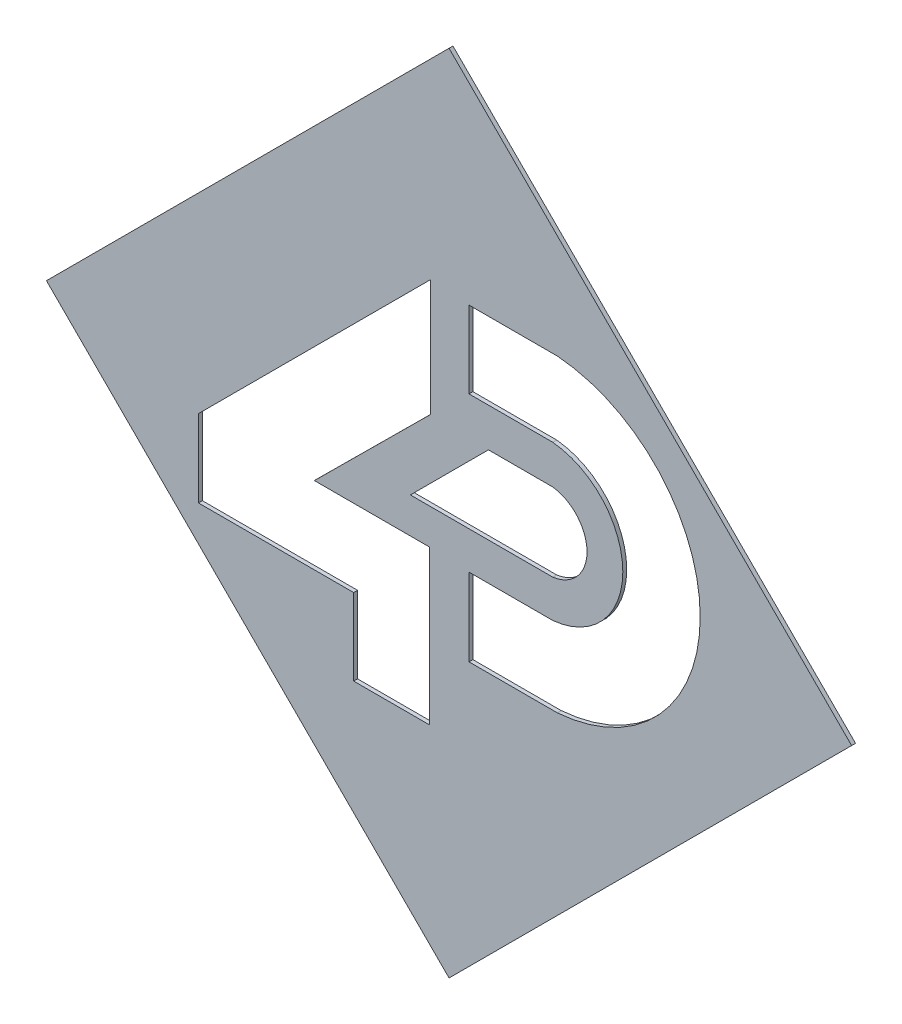
ISO-10303-21;
HEADER;
FILE_DESCRIPTION(('STEP AP214'),'2;1');
FILE_NAME('part.step','',(''),(''),'','','');
FILE_SCHEMA(('AUTOMOTIVE_DESIGN { 1 0 10303 214 1 1 1 1 }'));
ENDSEC;
DATA;
#1=APPLICATION_CONTEXT('core data for automotive mechanical design processes');
#2=APPLICATION_PROTOCOL_DEFINITION('international standard','automotive_design',2000,#1);
#3=PRODUCT_CONTEXT('',#1,'mechanical');
#4=PRODUCT('Part','Part','',(#3));
#5=PRODUCT_RELATED_PRODUCT_CATEGORY('part','',(#4));
#6=PRODUCT_DEFINITION_FORMATION('','',#4);
#7=PRODUCT_DEFINITION_CONTEXT('part definition',#1,'design');
#8=PRODUCT_DEFINITION('design','',#6,#7);
#9=PRODUCT_DEFINITION_SHAPE('','',#8);
#10=(LENGTH_UNIT() NAMED_UNIT(*) SI_UNIT(.MILLI.,.METRE.));
#11=(NAMED_UNIT(*) PLANE_ANGLE_UNIT() SI_UNIT($,.RADIAN.));
#12=(NAMED_UNIT(*) SI_UNIT($,.STERADIAN.) SOLID_ANGLE_UNIT());
#13=UNCERTAINTY_MEASURE_WITH_UNIT(LENGTH_MEASURE(1.E-05),#10,'distance_accuracy_value','');
#14=(GEOMETRIC_REPRESENTATION_CONTEXT(3) GLOBAL_UNCERTAINTY_ASSIGNED_CONTEXT((#13)) GLOBAL_UNIT_ASSIGNED_CONTEXT((#10,
#11,#12)) REPRESENTATION_CONTEXT('',''));
#15=CARTESIAN_POINT('',(0.,0.,0.));
#16=DIRECTION('',(0.,0.,1.));
#17=DIRECTION('',(1.,0.,0.));
#18=AXIS2_PLACEMENT_3D('',#15,#16,#17);
#19=CARTESIAN_POINT('',(5.70723061699978,-5.74708109341422,0.));
#20=DIRECTION('',(0.,0.,1.));
#21=DIRECTION('',(1.,0.,0.));
#22=AXIS2_PLACEMENT_3D('',#19,#20,#21);
#23=PLANE('',#22);
#24=DIRECTION('',(0.,1.,0.));
#25=VECTOR('',#24,1.);
#26=CARTESIAN_POINT('',(5.96345196568636,-5.74708109341422,0.));
#27=LINE('',#26,#25);
#28=CARTESIAN_POINT('',(5.96345196568636,7.21563884518157,0.));
#29=VERTEX_POINT('',#28);
#30=CARTESIAN_POINT('',(5.96345196568636,8.20293418286308,0.));
#31=VERTEX_POINT('',#30);
#32=EDGE_CURVE('E121',#29,#31,#27,.T.);
#33=ORIENTED_EDGE('',*,*,#32,.F.);
#34=DIRECTION('',(1.,0.,0.));
#35=VECTOR('',#34,1.);
#36=CARTESIAN_POINT('',(5.70723061699978,7.21563884518157,0.));
#37=LINE('',#36,#35);
#38=CARTESIAN_POINT('',(7.03943189194238,7.21563884518157,0.));
#39=VERTEX_POINT('',#38);
#40=EDGE_CURVE('E152',#39,#29,#37,.F.);
#41=ORIENTED_EDGE('',*,*,#40,.F.);
#42=CARTESIAN_POINT('',(6.94219559330286,6.22518063234392,0.));
#43=DIRECTION('',(0.,0.,-1.));
#44=DIRECTION('',(-1.,0.,0.));
#45=AXIS2_PLACEMENT_3D('',#42,#43,#44);
#46=CIRCLE('',#45,0.995219759224392);
#47=CARTESIAN_POINT('',(7.03943189194239,5.23472241950628,0.));
#48=VERTEX_POINT('',#47);
#49=EDGE_CURVE('E193',#48,#39,#46,.F.);
#50=ORIENTED_EDGE('',*,*,#49,.F.);
#51=DIRECTION('',(1.,0.,0.));
#52=VECTOR('',#51,1.);
#53=CARTESIAN_POINT('',(5.70723061699978,5.23472241950628,0.));
#54=LINE('',#53,#52);
#55=CARTESIAN_POINT('',(5.96345196568636,5.23472241950628,0.));
#56=VERTEX_POINT('',#55);
#57=EDGE_CURVE('E145',#56,#48,#54,.T.);
#58=ORIENTED_EDGE('',*,*,#57,.F.);
#59=DIRECTION('',(0.,1.,0.));
#60=VECTOR('',#59,1.);
#61=CARTESIAN_POINT('',(5.96345196568636,-5.74708109341422,0.));
#62=LINE('',#61,#60);
#63=CARTESIAN_POINT('',(5.96345196568636,4.23736010570448,0.));
#64=VERTEX_POINT('',#63);
#65=EDGE_CURVE('E156',#64,#56,#62,.T.);
#66=ORIENTED_EDGE('',*,*,#65,.F.);
#67=DIRECTION('',(1.,0.,0.));
#68=VECTOR('',#67,1.);
#69=CARTESIAN_POINT('',(5.70723061699978,4.23736010570448,0.));
#70=LINE('',#69,#68);
#71=CARTESIAN_POINT('',(7.09791288915832,4.23736010570448,0.));
#72=VERTEX_POINT('',#71);
#73=EDGE_CURVE('E162',#72,#64,#70,.F.);
#74=ORIENTED_EDGE('',*,*,#73,.F.);
#75=CARTESIAN_POINT('',(6.94208071668398,6.22014714428378,0.));
#76=DIRECTION('',(0.,0.,-1.));
#77=DIRECTION('',(-1.,0.,0.));
#78=AXIS2_PLACEMENT_3D('',#75,#76,#77);
#79=CIRCLE('',#78,1.98890123091524);
#80=CARTESIAN_POINT('',(7.09791288915832,8.20293418286308,0.));
#81=VERTEX_POINT('',#80);
#82=EDGE_CURVE('E165',#72,#81,#79,.F.);
#83=ORIENTED_EDGE('',*,*,#82,.T.);
#84=DIRECTION('',(1.,0.,0.));
#85=VECTOR('',#84,1.);
#86=CARTESIAN_POINT('',(5.70723061699978,8.20293418286308,0.));
#87=LINE('',#86,#85);
#88=EDGE_CURVE('E139',#31,#81,#87,.T.);
#89=ORIENTED_EDGE('',*,*,#88,.F.);
#90=EDGE_LOOP('',(#33,#41,#50,#58,#66,#74,#83,#89));
#91=FACE_BOUND('',#90,.T.);
#92=DIRECTION('',(-0.707106781186548,-0.707106781186547,0.));
#93=VECTOR('',#92,1.);
#94=CARTESIAN_POINT('',(-1.40455660225023,1.3647061258358,0.));
#95=LINE('',#94,#93);
#96=CARTESIAN_POINT('',(5.46891482688808,8.23817755497411,0.));
#97=VERTEX_POINT('',#96);
#98=CARTESIAN_POINT('',(2.49050407814656,5.25976680623259,0.));
#99=VERTEX_POINT('',#98);
#100=EDGE_CURVE('E142',#97,#99,#95,.T.);
#101=ORIENTED_EDGE('',*,*,#100,.T.);
#102=DIRECTION('',(0.,1.,0.));
#103=VECTOR('',#102,1.);
#104=CARTESIAN_POINT('',(2.49050407814656,-5.74708109341422,0.));
#105=LINE('',#104,#103);
#106=CARTESIAN_POINT('',(2.49050407814656,4.26743866233876,0.));
#107=VERTEX_POINT('',#106);
#108=EDGE_CURVE('E221',#99,#107,#105,.F.);
#109=ORIENTED_EDGE('',*,*,#108,.T.);
#110=DIRECTION('',(1.,0.,0.));
#111=VECTOR('',#110,1.);
#112=CARTESIAN_POINT('',(5.70723061699978,4.26743866233876,0.));
#113=LINE('',#112,#111);
#114=CARTESIAN_POINT('',(4.48311490015382,4.26743866233876,0.));
#115=VERTEX_POINT('',#114);
#116=EDGE_CURVE('E227',#107,#115,#113,.T.);
#117=ORIENTED_EDGE('',*,*,#116,.T.);
#118=DIRECTION('',(0.,1.,0.));
#119=VECTOR('',#118,1.);
#120=CARTESIAN_POINT('',(4.48311490015382,-5.74708109341422,0.));
#121=LINE('',#120,#119);
#122=CARTESIAN_POINT('',(4.48311490015382,3.28306505266452,0.));
#123=VERTEX_POINT('',#122);
#124=EDGE_CURVE('E236',#123,#115,#121,.T.);
#125=ORIENTED_EDGE('',*,*,#124,.F.);
#126=DIRECTION('',(1.,0.,0.));
#127=VECTOR('',#126,1.);
#128=CARTESIAN_POINT('',(5.70723061699978,3.28306505266452,0.));
#129=LINE('',#128,#127);
#130=CARTESIAN_POINT('',(5.45754534205358,3.28306505266452,0.));
#131=VERTEX_POINT('',#130);
#132=EDGE_CURVE('E242',#131,#123,#129,.F.);
#133=ORIENTED_EDGE('',*,*,#132,.F.);
#134=DIRECTION('',(0.,1.,0.));
#135=VECTOR('',#134,1.);
#136=CARTESIAN_POINT('',(5.45754534205358,-5.74708109341422,0.));
#137=LINE('',#136,#135);
#138=CARTESIAN_POINT('',(5.45754534205358,5.2597668062326,0.));
#139=VERTEX_POINT('',#138);
#140=EDGE_CURVE('E248',#139,#131,#137,.F.);
#141=ORIENTED_EDGE('',*,*,#140,.F.);
#142=DIRECTION('',(1.,0.,0.));
#143=VECTOR('',#142,1.);
#144=CARTESIAN_POINT('',(5.70723061699978,5.2597668062326,0.));
#145=LINE('',#144,#143);
#146=CARTESIAN_POINT('',(3.97800197720987,5.2597668062326,0.));
#147=VERTEX_POINT('',#146);
#148=EDGE_CURVE('E254',#147,#139,#145,.T.);
#149=ORIENTED_EDGE('',*,*,#148,.F.);
#150=DIRECTION('',(0.709780855705061,0.704422555625948,0.));
#151=VECTOR('',#150,1.);
#152=CARTESIAN_POINT('',(-0.654097831195002,0.662635792168032,0.));
#153=LINE('',#152,#151);
#154=CARTESIAN_POINT('',(5.46891482688808,6.73942440948345,0.));
#155=VERTEX_POINT('',#154);
#156=EDGE_CURVE('E257',#147,#155,#153,.T.);
#157=ORIENTED_EDGE('',*,*,#156,.T.);
#158=DIRECTION('',(0.,1.,0.));
#159=VECTOR('',#158,1.);
#160=CARTESIAN_POINT('',(5.46891482688808,-5.74708109341422,0.));
#161=LINE('',#160,#159);
#162=EDGE_CURVE('E263',#155,#97,#161,.T.);
#163=ORIENTED_EDGE('',*,*,#162,.T.);
#164=EDGE_LOOP('',(#101,#109,#117,#125,#133,#141,#149,#157,#163));
#165=FACE_BOUND('',#164,.T.);
#166=DIRECTION('',(0.707106781186547,0.707106781186548,0.));
#167=VECTOR('',#166,1.);
#168=CARTESIAN_POINT('',(-2.63109995533968,2.59124947892523,0.));
#169=LINE('',#168,#167);
#170=CARTESIAN_POINT('',(0.539968183111775,5.76231761737669,0.));
#171=VERTEX_POINT('',#170);
#172=CARTESIAN_POINT('',(5.70723061699977,10.9295800512647,0.));
#173=VERTEX_POINT('',#172);
#174=EDGE_CURVE('E266',#171,#173,#169,.T.);
#175=ORIENTED_EDGE('',*,*,#174,.T.);
#176=DIRECTION('',(0.707106781186548,-0.707106781186547,0.));
#177=VECTOR('',#176,1.);
#178=CARTESIAN_POINT('',(14.0455611893392,2.59124947892525,0.));
#179=LINE('',#178,#177);
#180=CARTESIAN_POINT('',(10.8744930508878,5.7623176173767,0.));
#181=VERTEX_POINT('',#180);
#182=EDGE_CURVE('E275',#173,#181,#179,.T.);
#183=ORIENTED_EDGE('',*,*,#182,.T.);
#184=DIRECTION('',(-0.707106781186547,-0.707106781186548,0.));
#185=VECTOR('',#184,1.);
#186=CARTESIAN_POINT('',(2.53616247854832,-2.57601295496276,0.));
#187=LINE('',#186,#185);
#188=CARTESIAN_POINT('',(5.70723061700028,0.595055183489199,0.));
#189=VERTEX_POINT('',#188);
#190=EDGE_CURVE('E281',#181,#189,#187,.T.);
#191=ORIENTED_EDGE('',*,*,#190,.T.);
#192=DIRECTION('',(0.707106781186686,-0.707106781186409,0.));
#193=VECTOR('',#192,1.);
#194=CARTESIAN_POINT('',(8.87829875545224,-2.57601295496051,0.));
#195=LINE('',#194,#193);
#196=EDGE_CURVE('E174',#171,#189,#195,.T.);
#197=ORIENTED_EDGE('',*,*,#196,.F.);
#198=EDGE_LOOP('',(#175,#183,#191,#197));
#199=FACE_BOUND('',#198,.T.);
#200=DIRECTION('',(-0.707106781186546,-0.707106781186549,0.));
#201=VECTOR('',#200,1.);
#202=CARTESIAN_POINT('',(-0.272743000415149,0.23289252400069,0.));
#203=LINE('',#202,#201);
#204=CARTESIAN_POINT('',(6.21265730286866,6.71829282728453,0.));
#205=VERTEX_POINT('',#204);
#206=CARTESIAN_POINT('',(5.21083901499033,5.71647453940619,0.));
#207=VERTEX_POINT('',#206);
#208=EDGE_CURVE('E135',#205,#207,#203,.T.);
#209=ORIENTED_EDGE('',*,*,#208,.T.);
#210=DIRECTION('',(1.,0.,0.));
#211=VECTOR('',#210,1.);
#212=CARTESIAN_POINT('',(5.70723061699978,5.71647453940619,0.));
#213=LINE('',#212,#211);
#214=CARTESIAN_POINT('',(7.03943189194239,5.71647453940619,0.));
#215=VERTEX_POINT('',#214);
#216=EDGE_CURVE('E108',#215,#207,#213,.F.);
#217=ORIENTED_EDGE('',*,*,#216,.F.);
#218=CARTESIAN_POINT('',(6.97275420186405,6.21738368334536,0.));
#219=DIRECTION('',(0.,0.,-1.));
#220=DIRECTION('',(-1.,0.,0.));
#221=AXIS2_PLACEMENT_3D('',#218,#219,#220);
#222=CIRCLE('',#221,0.505327502552606);
#223=CARTESIAN_POINT('',(7.0394318919424,6.71829282728453,0.));
#224=VERTEX_POINT('',#223);
#225=EDGE_CURVE('E19',#215,#224,#222,.F.);
#226=ORIENTED_EDGE('',*,*,#225,.T.);
#227=DIRECTION('',(1.,0.,0.));
#228=VECTOR('',#227,1.);
#229=CARTESIAN_POINT('',(5.70723061699978,6.71829282728452,0.));
#230=LINE('',#229,#228);
#231=EDGE_CURVE('E113',#224,#205,#230,.F.);
#232=ORIENTED_EDGE('',*,*,#231,.T.);
#233=EDGE_LOOP('',(#209,#217,#226,#232));
#234=FACE_BOUND('',#233,.T.);
#235=ADVANCED_FACE('F16',(#91,#165,#199,#234),#23,.F.);
#236=CARTESIAN_POINT('',(5.70723061699978,6.71829282728452,0.05));
#237=DIRECTION('',(0.,1.,0.));
#238=DIRECTION('',(0.,0.,1.));
#239=AXIS2_PLACEMENT_3D('',#236,#237,#238);
#240=PLANE('',#239);
#241=DIRECTION('',(0.,0.,-1.));
#242=VECTOR('',#241,1.);
#243=CARTESIAN_POINT('',(7.03943189194239,6.71829282728453,0.05));
#244=LINE('',#243,#242);
#245=CARTESIAN_POINT('',(7.03943189194239,6.71829282728453,0.05));
#246=VERTEX_POINT('',#245);
#247=EDGE_CURVE('E116',#224,#246,#244,.F.);
#248=ORIENTED_EDGE('',*,*,#247,.T.);
#249=DIRECTION('',(1.,0.,0.));
#250=VECTOR('',#249,1.);
#251=CARTESIAN_POINT('',(5.70723061699978,6.71829282728453,0.05));
#252=LINE('',#251,#250);
#253=CARTESIAN_POINT('',(6.21265730286866,6.71829282728453,0.05));
#254=VERTEX_POINT('',#253);
#255=EDGE_CURVE('E192',#254,#246,#252,.T.);
#256=ORIENTED_EDGE('',*,*,#255,.F.);
#257=DIRECTION('',(0.,0.,1.));
#258=VECTOR('',#257,1.);
#259=CARTESIAN_POINT('',(6.21265730286866,6.71829282728453,0.05));
#260=LINE('',#259,#258);
#261=EDGE_CURVE('E119',#254,#205,#260,.F.);
#262=ORIENTED_EDGE('',*,*,#261,.T.);
#263=ORIENTED_EDGE('',*,*,#231,.F.);
#264=EDGE_LOOP('',(#248,#256,#262,#263));
#265=FACE_BOUND('',#264,.T.);
#266=ADVANCED_FACE('F114',(#265),#240,.F.);
#267=CARTESIAN_POINT('',(6.97275420186405,6.21738368334536,0.05));
#268=DIRECTION('',(0.,0.,-1.));
#269=DIRECTION('',(-1.,0.,0.));
#270=AXIS2_PLACEMENT_3D('',#267,#268,#269);
#271=CYLINDRICAL_SURFACE('',#270,0.505327502552606);
#272=DIRECTION('',(0.,0.,1.));
#273=VECTOR('',#272,1.);
#274=CARTESIAN_POINT('',(7.03943189194239,5.71647453940619,0.05));
#275=LINE('',#274,#273);
#276=CARTESIAN_POINT('',(7.03943189194239,5.71647453940619,0.05));
#277=VERTEX_POINT('',#276);
#278=EDGE_CURVE('E178',#277,#215,#275,.F.);
#279=ORIENTED_EDGE('',*,*,#278,.F.);
#280=CARTESIAN_POINT('',(6.97275420186405,6.21738368334536,0.05));
#281=DIRECTION('',(0.,0.,-1.));
#282=DIRECTION('',(-1.,0.,0.));
#283=AXIS2_PLACEMENT_3D('',#280,#281,#282);
#284=CIRCLE('',#283,0.505327502552606);
#285=EDGE_CURVE('E127',#246,#277,#284,.T.);
#286=ORIENTED_EDGE('',*,*,#285,.F.);
#287=ORIENTED_EDGE('',*,*,#247,.F.);
#288=ORIENTED_EDGE('',*,*,#225,.F.);
#289=EDGE_LOOP('',(#279,#286,#287,#288));
#290=FACE_BOUND('',#289,.T.);
#291=ADVANCED_FACE('F125',(#290),#271,.F.);
#292=CARTESIAN_POINT('',(5.70723061699978,5.71647453940619,0.05));
#293=DIRECTION('',(0.,1.,0.));
#294=DIRECTION('',(0.,0.,1.));
#295=AXIS2_PLACEMENT_3D('',#292,#293,#294);
#296=PLANE('',#295);
#297=DIRECTION('',(1.,0.,0.));
#298=VECTOR('',#297,1.);
#299=CARTESIAN_POINT('',(5.70723061699978,5.71647453940619,0.05));
#300=LINE('',#299,#298);
#301=CARTESIAN_POINT('',(5.21083901499033,5.71647453940619,0.05));
#302=VERTEX_POINT('',#301);
#303=EDGE_CURVE('E191',#277,#302,#300,.F.);
#304=ORIENTED_EDGE('',*,*,#303,.F.);
#305=ORIENTED_EDGE('',*,*,#278,.T.);
#306=ORIENTED_EDGE('',*,*,#216,.T.);
#307=DIRECTION('',(0.,0.,1.));
#308=VECTOR('',#307,1.);
#309=CARTESIAN_POINT('',(5.21083901499033,5.71647453940619,0.05));
#310=LINE('',#309,#308);
#311=EDGE_CURVE('E136',#207,#302,#310,.T.);
#312=ORIENTED_EDGE('',*,*,#311,.T.);
#313=EDGE_LOOP('',(#304,#305,#306,#312));
#314=FACE_BOUND('',#313,.T.);
#315=ADVANCED_FACE('F299',(#314),#296,.T.);
#316=CARTESIAN_POINT('',(-0.272743000415149,0.23289252400069,0.05));
#317=DIRECTION('',(-0.707106781186549,0.707106781186546,0.));
#318=DIRECTION('',(-0.707106781186546,-0.707106781186549,0.));
#319=AXIS2_PLACEMENT_3D('',#316,#317,#318);
#320=PLANE('',#319);
#321=ORIENTED_EDGE('',*,*,#261,.F.);
#322=DIRECTION('',(0.707106781186547,0.707106781186548,0.));
#323=VECTOR('',#322,1.);
#324=CARTESIAN_POINT('',(5.21083901499033,5.71647453940619,0.05));
#325=LINE('',#324,#323);
#326=EDGE_CURVE('E290',#302,#254,#325,.T.);
#327=ORIENTED_EDGE('',*,*,#326,.F.);
#328=ORIENTED_EDGE('',*,*,#311,.F.);
#329=ORIENTED_EDGE('',*,*,#208,.F.);
#330=EDGE_LOOP('',(#321,#327,#328,#329));
#331=FACE_BOUND('',#330,.T.);
#332=ADVANCED_FACE('F302',(#331),#320,.F.);
#333=CARTESIAN_POINT('',(8.87829875545224,-2.57601295496051,0.05));
#334=DIRECTION('',(-0.707106781186409,-0.707106781186686,0.));
#335=DIRECTION('',(0.707106781186686,-0.707106781186409,0.));
#336=AXIS2_PLACEMENT_3D('',#333,#334,#335);
#337=PLANE('',#336);
#338=DIRECTION('',(0.707106781186548,-0.707106781186547,0.));
#339=VECTOR('',#338,1.);
#340=CARTESIAN_POINT('',(0.539968183111775,5.76231761737669,0.05));
#341=LINE('',#340,#339);
#342=CARTESIAN_POINT('',(0.539968183111775,5.76231761737669,0.05));
#343=VERTEX_POINT('',#342);
#344=CARTESIAN_POINT('',(5.70723061700028,0.595055183489199,0.05));
#345=VERTEX_POINT('',#344);
#346=EDGE_CURVE('E293',#343,#345,#341,.T.);
#347=ORIENTED_EDGE('',*,*,#346,.F.);
#348=DIRECTION('',(0.,0.,1.));
#349=VECTOR('',#348,1.);
#350=CARTESIAN_POINT('',(0.539968183111776,5.76231761737669,0.05));
#351=LINE('',#350,#349);
#352=EDGE_CURVE('E269',#343,#171,#351,.F.);
#353=ORIENTED_EDGE('',*,*,#352,.T.);
#354=ORIENTED_EDGE('',*,*,#196,.T.);
#355=DIRECTION('',(0.,0.,1.));
#356=VECTOR('',#355,1.);
#357=CARTESIAN_POINT('',(5.70723061699978,0.595055183488693,0.05));
#358=LINE('',#357,#356);
#359=EDGE_CURVE('E284',#189,#345,#358,.T.);
#360=ORIENTED_EDGE('',*,*,#359,.T.);
#361=EDGE_LOOP('',(#347,#353,#354,#360));
#362=FACE_BOUND('',#361,.T.);
#363=ADVANCED_FACE('F402',(#362),#337,.T.);
#364=CARTESIAN_POINT('',(2.53616247854832,-2.57601295496276,0.05));
#365=DIRECTION('',(-0.707106781186548,0.707106781186547,0.));
#366=DIRECTION('',(-0.707106781186547,-0.707106781186548,0.));
#367=AXIS2_PLACEMENT_3D('',#364,#365,#366);
#368=PLANE('',#367);
#369=DIRECTION('',(0.,0.,1.));
#370=VECTOR('',#369,1.);
#371=CARTESIAN_POINT('',(10.8744930508878,5.7623176173767,0.05));
#372=LINE('',#371,#370);
#373=CARTESIAN_POINT('',(10.8744930508878,5.7623176173767,0.05));
#374=VERTEX_POINT('',#373);
#375=EDGE_CURVE('E278',#181,#374,#372,.T.);
#376=ORIENTED_EDGE('',*,*,#375,.T.);
#377=DIRECTION('',(0.707106781186547,0.707106781186548,0.));
#378=VECTOR('',#377,1.);
#379=CARTESIAN_POINT('',(5.70723061699978,0.595055183488694,0.05));
#380=LINE('',#379,#378);
#381=EDGE_CURVE('E390',#345,#374,#380,.T.);
#382=ORIENTED_EDGE('',*,*,#381,.F.);
#383=ORIENTED_EDGE('',*,*,#359,.F.);
#384=ORIENTED_EDGE('',*,*,#190,.F.);
#385=EDGE_LOOP('',(#376,#382,#383,#384));
#386=FACE_BOUND('',#385,.T.);
#387=ADVANCED_FACE('F590',(#386),#368,.F.);
#388=CARTESIAN_POINT('',(14.0455611893392,2.59124947892525,0.05));
#389=DIRECTION('',(-0.707106781186547,-0.707106781186548,0.));
#390=DIRECTION('',(0.707106781186548,-0.707106781186547,0.));
#391=AXIS2_PLACEMENT_3D('',#388,#389,#390);
#392=PLANE('',#391);
#393=DIRECTION('',(0.,0.,1.));
#394=VECTOR('',#393,1.);
#395=CARTESIAN_POINT('',(5.70723061699977,10.9295800512647,0.05));
#396=LINE('',#395,#394);
#397=CARTESIAN_POINT('',(5.70723061699977,10.9295800512647,0.05));
#398=VERTEX_POINT('',#397);
#399=EDGE_CURVE('E272',#173,#398,#396,.T.);
#400=ORIENTED_EDGE('',*,*,#399,.T.);
#401=DIRECTION('',(-0.707106781186548,0.707106781186547,0.));
#402=VECTOR('',#401,1.);
#403=CARTESIAN_POINT('',(10.8744930508878,5.7623176173767,0.05));
#404=LINE('',#403,#402);
#405=EDGE_CURVE('E388',#374,#398,#404,.T.);
#406=ORIENTED_EDGE('',*,*,#405,.F.);
#407=ORIENTED_EDGE('',*,*,#375,.F.);
#408=ORIENTED_EDGE('',*,*,#182,.F.);
#409=EDGE_LOOP('',(#400,#406,#407,#408));
#410=FACE_BOUND('',#409,.T.);
#411=ADVANCED_FACE('F587',(#410),#392,.F.);
#412=CARTESIAN_POINT('',(-2.63109995533968,2.59124947892523,0.05));
#413=DIRECTION('',(0.707106781186548,-0.707106781186547,0.));
#414=DIRECTION('',(0.707106781186547,0.707106781186548,0.));
#415=AXIS2_PLACEMENT_3D('',#412,#413,#414);
#416=PLANE('',#415);
#417=ORIENTED_EDGE('',*,*,#352,.F.);
#418=DIRECTION('',(-0.707106781186547,-0.707106781186548,0.));
#419=VECTOR('',#418,1.);
#420=CARTESIAN_POINT('',(5.70723061699977,10.9295800512647,0.05));
#421=LINE('',#420,#419);
#422=EDGE_CURVE('E385',#398,#343,#421,.T.);
#423=ORIENTED_EDGE('',*,*,#422,.F.);
#424=ORIENTED_EDGE('',*,*,#399,.F.);
#425=ORIENTED_EDGE('',*,*,#174,.F.);
#426=EDGE_LOOP('',(#417,#423,#424,#425));
#427=FACE_BOUND('',#426,.T.);
#428=ADVANCED_FACE('F408',(#427),#416,.F.);
#429=CARTESIAN_POINT('',(5.46891482688808,-5.74708109341422,0.05));
#430=DIRECTION('',(1.,0.,0.));
#431=DIRECTION('',(0.,0.,-1.));
#432=AXIS2_PLACEMENT_3D('',#429,#430,#431);
#433=PLANE('',#432);
#434=DIRECTION('',(0.,0.,1.));
#435=VECTOR('',#434,1.);
#436=CARTESIAN_POINT('',(5.46891482688808,6.73942440948345,0.05));
#437=LINE('',#436,#435);
#438=CARTESIAN_POINT('',(5.46891482688808,6.73942440948345,0.05));
#439=VERTEX_POINT('',#438);
#440=EDGE_CURVE('E260',#155,#439,#437,.T.);
#441=ORIENTED_EDGE('',*,*,#440,.T.);
#442=DIRECTION('',(0.,1.,0.));
#443=VECTOR('',#442,1.);
#444=CARTESIAN_POINT('',(5.46891482688808,-5.74708109341422,0.05));
#445=LINE('',#444,#443);
#446=CARTESIAN_POINT('',(5.46891482688808,8.23817755497411,0.05));
#447=VERTEX_POINT('',#446);
#448=EDGE_CURVE('E382',#447,#439,#445,.F.);
#449=ORIENTED_EDGE('',*,*,#448,.F.);
#450=DIRECTION('',(0.,0.,1.));
#451=VECTOR('',#450,1.);
#452=CARTESIAN_POINT('',(5.46891482688808,8.23817755497411,0.05));
#453=LINE('',#452,#451);
#454=EDGE_CURVE('E215',#447,#97,#453,.F.);
#455=ORIENTED_EDGE('',*,*,#454,.T.);
#456=ORIENTED_EDGE('',*,*,#162,.F.);
#457=EDGE_LOOP('',(#441,#449,#455,#456));
#458=FACE_BOUND('',#457,.T.);
#459=ADVANCED_FACE('F487',(#458),#433,.F.);
#460=CARTESIAN_POINT('',(-0.654097831195002,0.662635792168032,0.05));
#461=DIRECTION('',(0.704422555625948,-0.709780855705061,0.));
#462=DIRECTION('',(0.709780855705061,0.704422555625948,0.));
#463=AXIS2_PLACEMENT_3D('',#460,#461,#462);
#464=PLANE('',#463);
#465=DIRECTION('',(0.,0.,-1.));
#466=VECTOR('',#465,1.);
#467=CARTESIAN_POINT('',(3.97800197720986,5.2597668062326,0.05));
#468=LINE('',#467,#466);
#469=CARTESIAN_POINT('',(3.97800197720987,5.25976680623259,0.05));
#470=VERTEX_POINT('',#469);
#471=EDGE_CURVE('E251',#470,#147,#468,.T.);
#472=ORIENTED_EDGE('',*,*,#471,.F.);
#473=DIRECTION('',(-0.709780855705061,-0.704422555625948,0.));
#474=VECTOR('',#473,1.);
#475=CARTESIAN_POINT('',(5.46891482688808,6.73942440948345,0.05));
#476=LINE('',#475,#474);
#477=EDGE_CURVE('E379',#439,#470,#476,.T.);
#478=ORIENTED_EDGE('',*,*,#477,.F.);
#479=ORIENTED_EDGE('',*,*,#440,.F.);
#480=ORIENTED_EDGE('',*,*,#156,.F.);
#481=EDGE_LOOP('',(#472,#478,#479,#480));
#482=FACE_BOUND('',#481,.T.);
#483=ADVANCED_FACE('F491',(#482),#464,.F.);
#484=CARTESIAN_POINT('',(5.70723061699978,5.2597668062326,0.05));
#485=DIRECTION('',(0.,-1.,0.));
#486=DIRECTION('',(0.,0.,-1.));
#487=AXIS2_PLACEMENT_3D('',#484,#485,#486);
#488=PLANE('',#487);
#489=DIRECTION('',(1.,0.,0.));
#490=VECTOR('',#489,1.);
#491=CARTESIAN_POINT('',(5.70723061699978,5.2597668062326,0.05));
#492=LINE('',#491,#490);
#493=CARTESIAN_POINT('',(5.45754534205358,5.2597668062326,0.05));
#494=VERTEX_POINT('',#493);
#495=EDGE_CURVE('E376',#470,#494,#492,.T.);
#496=ORIENTED_EDGE('',*,*,#495,.F.);
#497=ORIENTED_EDGE('',*,*,#471,.T.);
#498=ORIENTED_EDGE('',*,*,#148,.T.);
#499=DIRECTION('',(0.,0.,1.));
#500=VECTOR('',#499,1.);
#501=CARTESIAN_POINT('',(5.45754534205358,5.2597668062326,0.05));
#502=LINE('',#501,#500);
#503=EDGE_CURVE('E245',#494,#139,#502,.F.);
#504=ORIENTED_EDGE('',*,*,#503,.F.);
#505=EDGE_LOOP('',(#496,#497,#498,#504));
#506=FACE_BOUND('',#505,.T.);
#507=ADVANCED_FACE('F493',(#506),#488,.T.);
#508=CARTESIAN_POINT('',(5.45754534205358,-5.74708109341422,0.05));
#509=DIRECTION('',(-1.,0.,0.));
#510=DIRECTION('',(0.,0.,1.));
#511=AXIS2_PLACEMENT_3D('',#508,#509,#510);
#512=PLANE('',#511);
#513=DIRECTION('',(0.,1.,0.));
#514=VECTOR('',#513,1.);
#515=CARTESIAN_POINT('',(5.45754534205358,-5.74708109341422,0.05));
#516=LINE('',#515,#514);
#517=CARTESIAN_POINT('',(5.45754534205358,3.28306505266452,0.05));
#518=VERTEX_POINT('',#517);
#519=EDGE_CURVE('E373',#494,#518,#516,.F.);
#520=ORIENTED_EDGE('',*,*,#519,.F.);
#521=ORIENTED_EDGE('',*,*,#503,.T.);
#522=ORIENTED_EDGE('',*,*,#140,.T.);
#523=DIRECTION('',(0.,0.,1.));
#524=VECTOR('',#523,1.);
#525=CARTESIAN_POINT('',(5.45754534205358,3.28306505266452,0.05));
#526=LINE('',#525,#524);
#527=EDGE_CURVE('E239',#518,#131,#526,.F.);
#528=ORIENTED_EDGE('',*,*,#527,.F.);
#529=EDGE_LOOP('',(#520,#521,#522,#528));
#530=FACE_BOUND('',#529,.T.);
#531=ADVANCED_FACE('F496',(#530),#512,.T.);
#532=CARTESIAN_POINT('',(5.70723061699978,3.28306505266452,0.05));
#533=DIRECTION('',(0.,1.,0.));
#534=DIRECTION('',(0.,0.,1.));
#535=AXIS2_PLACEMENT_3D('',#532,#533,#534);
#536=PLANE('',#535);
#537=DIRECTION('',(1.,0.,0.));
#538=VECTOR('',#537,1.);
#539=CARTESIAN_POINT('',(5.70723061699978,3.28306505266452,0.05));
#540=LINE('',#539,#538);
#541=CARTESIAN_POINT('',(4.48311490015382,3.28306505266452,0.05));
#542=VERTEX_POINT('',#541);
#543=EDGE_CURVE('E370',#518,#542,#540,.F.);
#544=ORIENTED_EDGE('',*,*,#543,.F.);
#545=ORIENTED_EDGE('',*,*,#527,.T.);
#546=ORIENTED_EDGE('',*,*,#132,.T.);
#547=DIRECTION('',(0.,0.,-1.));
#548=VECTOR('',#547,1.);
#549=CARTESIAN_POINT('',(4.48311490015382,3.28306505266452,0.05));
#550=LINE('',#549,#548);
#551=EDGE_CURVE('E233',#542,#123,#550,.T.);
#552=ORIENTED_EDGE('',*,*,#551,.F.);
#553=EDGE_LOOP('',(#544,#545,#546,#552));
#554=FACE_BOUND('',#553,.T.);
#555=ADVANCED_FACE('F499',(#554),#536,.T.);
#556=CARTESIAN_POINT('',(4.48311490015382,-5.74708109341422,0.05));
#557=DIRECTION('',(1.,0.,0.));
#558=DIRECTION('',(0.,0.,-1.));
#559=AXIS2_PLACEMENT_3D('',#556,#557,#558);
#560=PLANE('',#559);
#561=DIRECTION('',(0.,1.,0.));
#562=VECTOR('',#561,1.);
#563=CARTESIAN_POINT('',(4.48311490015382,-5.74708109341422,0.05));
#564=LINE('',#563,#562);
#565=CARTESIAN_POINT('',(4.48311490015382,4.26743866233876,0.05));
#566=VERTEX_POINT('',#565);
#567=EDGE_CURVE('E367',#542,#566,#564,.T.);
#568=ORIENTED_EDGE('',*,*,#567,.F.);
#569=ORIENTED_EDGE('',*,*,#551,.T.);
#570=ORIENTED_EDGE('',*,*,#124,.T.);
#571=DIRECTION('',(0.,0.,-1.));
#572=VECTOR('',#571,1.);
#573=CARTESIAN_POINT('',(4.48311490015382,4.26743866233876,0.05));
#574=LINE('',#573,#572);
#575=EDGE_CURVE('E230',#115,#566,#574,.F.);
#576=ORIENTED_EDGE('',*,*,#575,.T.);
#577=EDGE_LOOP('',(#568,#569,#570,#576));
#578=FACE_BOUND('',#577,.T.);
#579=ADVANCED_FACE('F501',(#578),#560,.T.);
#580=CARTESIAN_POINT('',(5.70723061699978,4.26743866233876,0.05));
#581=DIRECTION('',(0.,-1.,0.));
#582=DIRECTION('',(0.,0.,-1.));
#583=AXIS2_PLACEMENT_3D('',#580,#581,#582);
#584=PLANE('',#583);
#585=DIRECTION('',(0.,0.,1.));
#586=VECTOR('',#585,1.);
#587=CARTESIAN_POINT('',(2.49050407814656,4.26743866233876,0.05));
#588=LINE('',#587,#586);
#589=CARTESIAN_POINT('',(2.49050407814656,4.26743866233876,0.05));
#590=VERTEX_POINT('',#589);
#591=EDGE_CURVE('E224',#107,#590,#588,.T.);
#592=ORIENTED_EDGE('',*,*,#591,.T.);
#593=DIRECTION('',(1.,0.,0.));
#594=VECTOR('',#593,1.);
#595=CARTESIAN_POINT('',(5.70723061699978,4.26743866233876,0.05));
#596=LINE('',#595,#594);
#597=EDGE_CURVE('E364',#566,#590,#596,.F.);
#598=ORIENTED_EDGE('',*,*,#597,.F.);
#599=ORIENTED_EDGE('',*,*,#575,.F.);
#600=ORIENTED_EDGE('',*,*,#116,.F.);
#601=EDGE_LOOP('',(#592,#598,#599,#600));
#602=FACE_BOUND('',#601,.T.);
#603=ADVANCED_FACE('F483',(#602),#584,.F.);
#604=CARTESIAN_POINT('',(2.49050407814656,-5.74708109341422,0.05));
#605=DIRECTION('',(-1.,0.,0.));
#606=DIRECTION('',(0.,0.,1.));
#607=AXIS2_PLACEMENT_3D('',#604,#605,#606);
#608=PLANE('',#607);
#609=DIRECTION('',(0.,0.,1.));
#610=VECTOR('',#609,1.);
#611=CARTESIAN_POINT('',(2.49050407814656,5.2597668062326,0.05));
#612=LINE('',#611,#610);
#613=CARTESIAN_POINT('',(2.49050407814656,5.25976680623259,0.05));
#614=VERTEX_POINT('',#613);
#615=EDGE_CURVE('E218',#99,#614,#612,.T.);
#616=ORIENTED_EDGE('',*,*,#615,.T.);
#617=DIRECTION('',(0.,1.,0.));
#618=VECTOR('',#617,1.);
#619=CARTESIAN_POINT('',(2.49050407814656,-5.74708109341422,0.05));
#620=LINE('',#619,#618);
#621=EDGE_CURVE('E354',#590,#614,#620,.T.);
#622=ORIENTED_EDGE('',*,*,#621,.F.);
#623=ORIENTED_EDGE('',*,*,#591,.F.);
#624=ORIENTED_EDGE('',*,*,#108,.F.);
#625=EDGE_LOOP('',(#616,#622,#623,#624));
#626=FACE_BOUND('',#625,.T.);
#627=ADVANCED_FACE('F473',(#626),#608,.F.);
#628=CARTESIAN_POINT('',(-1.40455660225023,1.3647061258358,0.05));
#629=DIRECTION('',(-0.707106781186547,0.707106781186548,0.));
#630=DIRECTION('',(-0.707106781186548,-0.707106781186547,0.));
#631=AXIS2_PLACEMENT_3D('',#628,#629,#630);
#632=PLANE('',#631);
#633=ORIENTED_EDGE('',*,*,#454,.F.);
#634=DIRECTION('',(0.707106781186548,0.707106781186548,0.));
#635=VECTOR('',#634,1.);
#636=CARTESIAN_POINT('',(2.49050407814656,5.2597668062326,0.05));
#637=LINE('',#636,#635);
#638=EDGE_CURVE('E351',#614,#447,#637,.T.);
#639=ORIENTED_EDGE('',*,*,#638,.F.);
#640=ORIENTED_EDGE('',*,*,#615,.F.);
#641=ORIENTED_EDGE('',*,*,#100,.F.);
#642=EDGE_LOOP('',(#633,#639,#640,#641));
#643=FACE_BOUND('',#642,.T.);
#644=ADVANCED_FACE('F478',(#643),#632,.F.);
#645=CARTESIAN_POINT('',(5.70723061699978,8.20293418286308,0.05));
#646=DIRECTION('',(0.,-1.,0.));
#647=DIRECTION('',(0.,0.,-1.));
#648=AXIS2_PLACEMENT_3D('',#645,#646,#647);
#649=PLANE('',#648);
#650=DIRECTION('',(1.,0.,0.));
#651=VECTOR('',#650,1.);
#652=CARTESIAN_POINT('',(5.70723061699978,8.20293418286308,0.05));
#653=LINE('',#652,#651);
#654=CARTESIAN_POINT('',(5.96345196568636,8.20293418286308,0.05));
#655=VERTEX_POINT('',#654);
#656=CARTESIAN_POINT('',(7.09791288915832,8.20293418286308,0.05));
#657=VERTEX_POINT('',#656);
#658=EDGE_CURVE('E189',#655,#657,#653,.T.);
#659=ORIENTED_EDGE('',*,*,#658,.F.);
#660=DIRECTION('',(0.,0.,-1.));
#661=VECTOR('',#660,1.);
#662=CARTESIAN_POINT('',(5.96345196568636,8.20293418286308,0.05));
#663=LINE('',#662,#661);
#664=EDGE_CURVE('E207',#31,#655,#663,.F.);
#665=ORIENTED_EDGE('',*,*,#664,.F.);
#666=ORIENTED_EDGE('',*,*,#88,.T.);
#667=DIRECTION('',(0.,0.,-1.));
#668=VECTOR('',#667,1.);
#669=CARTESIAN_POINT('',(7.09791288915831,8.20293418286308,0.05));
#670=LINE('',#669,#668);
#671=EDGE_CURVE('E141',#81,#657,#670,.F.);
#672=ORIENTED_EDGE('',*,*,#671,.T.);
#673=EDGE_LOOP('',(#659,#665,#666,#672));
#674=FACE_BOUND('',#673,.T.);
#675=ADVANCED_FACE('F537',(#674),#649,.T.);
#676=CARTESIAN_POINT('',(6.94208071668398,6.22014714428378,0.05));
#677=DIRECTION('',(0.,0.,-1.));
#678=DIRECTION('',(-1.,0.,0.));
#679=AXIS2_PLACEMENT_3D('',#676,#677,#678);
#680=CYLINDRICAL_SURFACE('',#679,1.98890123091524);
#681=DIRECTION('',(0.,0.,1.));
#682=VECTOR('',#681,1.);
#683=CARTESIAN_POINT('',(7.09791288915831,4.23736010570448,0.05));
#684=LINE('',#683,#682);
#685=CARTESIAN_POINT('',(7.09791288915832,4.23736010570448,0.05));
#686=VERTEX_POINT('',#685);
#687=EDGE_CURVE('E159',#686,#72,#684,.F.);
#688=ORIENTED_EDGE('',*,*,#687,.F.);
#689=CARTESIAN_POINT('',(6.94208071668398,6.22014714428378,0.05));
#690=DIRECTION('',(0.,0.,-1.));
#691=DIRECTION('',(-1.,0.,0.));
#692=AXIS2_PLACEMENT_3D('',#689,#690,#691);
#693=CIRCLE('',#692,1.98890123091524);
#694=EDGE_CURVE('E185',#657,#686,#693,.T.);
#695=ORIENTED_EDGE('',*,*,#694,.F.);
#696=ORIENTED_EDGE('',*,*,#671,.F.);
#697=ORIENTED_EDGE('',*,*,#82,.F.);
#698=EDGE_LOOP('',(#688,#695,#696,#697));
#699=FACE_BOUND('',#698,.T.);
#700=ADVANCED_FACE('F345',(#699),#680,.F.);
#701=CARTESIAN_POINT('',(5.70723061699978,4.23736010570448,0.05));
#702=DIRECTION('',(0.,1.,0.));
#703=DIRECTION('',(0.,0.,1.));
#704=AXIS2_PLACEMENT_3D('',#701,#702,#703);
#705=PLANE('',#704);
#706=DIRECTION('',(1.,0.,0.));
#707=VECTOR('',#706,1.);
#708=CARTESIAN_POINT('',(5.70723061699978,4.23736010570448,0.05));
#709=LINE('',#708,#707);
#710=CARTESIAN_POINT('',(5.96345196568636,4.23736010570448,0.05));
#711=VERTEX_POINT('',#710);
#712=EDGE_CURVE('E188',#686,#711,#709,.F.);
#713=ORIENTED_EDGE('',*,*,#712,.F.);
#714=ORIENTED_EDGE('',*,*,#687,.T.);
#715=ORIENTED_EDGE('',*,*,#73,.T.);
#716=DIRECTION('',(0.,0.,-1.));
#717=VECTOR('',#716,1.);
#718=CARTESIAN_POINT('',(5.96345196568636,4.23736010570448,0.05));
#719=LINE('',#718,#717);
#720=EDGE_CURVE('E149',#711,#64,#719,.T.);
#721=ORIENTED_EDGE('',*,*,#720,.F.);
#722=EDGE_LOOP('',(#713,#714,#715,#721));
#723=FACE_BOUND('',#722,.T.);
#724=ADVANCED_FACE('F340',(#723),#705,.T.);
#725=CARTESIAN_POINT('',(5.96345196568636,-5.74708109341422,0.05));
#726=DIRECTION('',(1.,0.,0.));
#727=DIRECTION('',(0.,0.,-1.));
#728=AXIS2_PLACEMENT_3D('',#725,#726,#727);
#729=PLANE('',#728);
#730=DIRECTION('',(0.,1.,0.));
#731=VECTOR('',#730,1.);
#732=CARTESIAN_POINT('',(5.96345196568636,-5.74708109341422,0.05));
#733=LINE('',#732,#731);
#734=CARTESIAN_POINT('',(5.96345196568636,5.23472241950628,0.05));
#735=VERTEX_POINT('',#734);
#736=EDGE_CURVE('E327',#711,#735,#733,.T.);
#737=ORIENTED_EDGE('',*,*,#736,.F.);
#738=ORIENTED_EDGE('',*,*,#720,.T.);
#739=ORIENTED_EDGE('',*,*,#65,.T.);
#740=DIRECTION('',(0.,0.,-1.));
#741=VECTOR('',#740,1.);
#742=CARTESIAN_POINT('',(5.96345196568636,5.23472241950628,0.05));
#743=LINE('',#742,#741);
#744=EDGE_CURVE('E148',#735,#56,#743,.T.);
#745=ORIENTED_EDGE('',*,*,#744,.F.);
#746=EDGE_LOOP('',(#737,#738,#739,#745));
#747=FACE_BOUND('',#746,.T.);
#748=ADVANCED_FACE('F336',(#747),#729,.T.);
#749=CARTESIAN_POINT('',(5.70723061699978,5.23472241950628,0.05));
#750=DIRECTION('',(0.,-1.,0.));
#751=DIRECTION('',(0.,0.,-1.));
#752=AXIS2_PLACEMENT_3D('',#749,#750,#751);
#753=PLANE('',#752);
#754=DIRECTION('',(1.,0.,0.));
#755=VECTOR('',#754,1.);
#756=CARTESIAN_POINT('',(5.70723061699978,5.23472241950628,0.05));
#757=LINE('',#756,#755);
#758=CARTESIAN_POINT('',(7.03943189194239,5.23472241950628,0.05));
#759=VERTEX_POINT('',#758);
#760=EDGE_CURVE('E184',#735,#759,#757,.T.);
#761=ORIENTED_EDGE('',*,*,#760,.F.);
#762=ORIENTED_EDGE('',*,*,#744,.T.);
#763=ORIENTED_EDGE('',*,*,#57,.T.);
#764=DIRECTION('',(0.,0.,-1.));
#765=VECTOR('',#764,1.);
#766=CARTESIAN_POINT('',(7.03943189194239,5.23472241950628,0.05));
#767=LINE('',#766,#765);
#768=EDGE_CURVE('E195',#759,#48,#767,.T.);
#769=ORIENTED_EDGE('',*,*,#768,.F.);
#770=EDGE_LOOP('',(#761,#762,#763,#769));
#771=FACE_BOUND('',#770,.T.);
#772=ADVANCED_FACE('F526',(#771),#753,.T.);
#773=CARTESIAN_POINT('',(6.94219559330286,6.22518063234392,0.05));
#774=DIRECTION('',(0.,0.,-1.));
#775=DIRECTION('',(-1.,0.,0.));
#776=AXIS2_PLACEMENT_3D('',#773,#774,#775);
#777=CYLINDRICAL_SURFACE('',#776,0.995219759224392);
#778=CARTESIAN_POINT('',(6.94219559330286,6.22518063234392,0.05));
#779=DIRECTION('',(0.,0.,-1.));
#780=DIRECTION('',(-1.,0.,0.));
#781=AXIS2_PLACEMENT_3D('',#778,#779,#780);
#782=CIRCLE('',#781,0.995219759224392);
#783=CARTESIAN_POINT('',(7.03943189194238,7.21563884518157,0.05));
#784=VERTEX_POINT('',#783);
#785=EDGE_CURVE('E181',#759,#784,#782,.F.);
#786=ORIENTED_EDGE('',*,*,#785,.F.);
#787=ORIENTED_EDGE('',*,*,#768,.T.);
#788=ORIENTED_EDGE('',*,*,#49,.T.);
#789=DIRECTION('',(0.,0.,1.));
#790=VECTOR('',#789,1.);
#791=CARTESIAN_POINT('',(7.03943189194239,7.21563884518157,0.05));
#792=LINE('',#791,#790);
#793=EDGE_CURVE('E210',#784,#39,#792,.F.);
#794=ORIENTED_EDGE('',*,*,#793,.F.);
#795=EDGE_LOOP('',(#786,#787,#788,#794));
#796=FACE_BOUND('',#795,.T.);
#797=ADVANCED_FACE('F523',(#796),#777,.T.);
#798=CARTESIAN_POINT('',(5.70723061699978,7.21563884518157,0.05));
#799=DIRECTION('',(0.,1.,0.));
#800=DIRECTION('',(0.,0.,1.));
#801=AXIS2_PLACEMENT_3D('',#798,#799,#800);
#802=PLANE('',#801);
#803=DIRECTION('',(1.,0.,0.));
#804=VECTOR('',#803,1.);
#805=CARTESIAN_POINT('',(5.70723061699978,7.21563884518157,0.05));
#806=LINE('',#805,#804);
#807=CARTESIAN_POINT('',(5.96345196568636,7.21563884518157,0.05));
#808=VERTEX_POINT('',#807);
#809=EDGE_CURVE('E25',#784,#808,#806,.F.);
#810=ORIENTED_EDGE('',*,*,#809,.F.);
#811=ORIENTED_EDGE('',*,*,#793,.T.);
#812=ORIENTED_EDGE('',*,*,#40,.T.);
#813=DIRECTION('',(0.,0.,-1.));
#814=VECTOR('',#813,1.);
#815=CARTESIAN_POINT('',(5.96345196568636,7.21563884518157,0.05));
#816=LINE('',#815,#814);
#817=EDGE_CURVE('E34',#808,#29,#816,.T.);
#818=ORIENTED_EDGE('',*,*,#817,.F.);
#819=EDGE_LOOP('',(#810,#811,#812,#818));
#820=FACE_BOUND('',#819,.T.);
#821=ADVANCED_FACE('F517',(#820),#802,.T.);
#822=CARTESIAN_POINT('',(5.96345196568636,-5.74708109341422,0.05));
#823=DIRECTION('',(1.,0.,0.));
#824=DIRECTION('',(0.,0.,-1.));
#825=AXIS2_PLACEMENT_3D('',#822,#823,#824);
#826=PLANE('',#825);
#827=DIRECTION('',(0.,1.,0.));
#828=VECTOR('',#827,1.);
#829=CARTESIAN_POINT('',(5.96345196568636,-5.74708109341422,0.05));
#830=LINE('',#829,#828);
#831=EDGE_CURVE('E10',#808,#655,#830,.T.);
#832=ORIENTED_EDGE('',*,*,#831,.F.);
#833=ORIENTED_EDGE('',*,*,#817,.T.);
#834=ORIENTED_EDGE('',*,*,#32,.T.);
#835=ORIENTED_EDGE('',*,*,#664,.T.);
#836=EDGE_LOOP('',(#832,#833,#834,#835));
#837=FACE_BOUND('',#836,.T.);
#838=ADVANCED_FACE('F512',(#837),#826,.T.);
#839=CARTESIAN_POINT('',(5.70723061699978,-5.74708109341422,0.05));
#840=DIRECTION('',(0.,0.,1.));
#841=DIRECTION('',(1.,0.,0.));
#842=AXIS2_PLACEMENT_3D('',#839,#840,#841);
#843=PLANE('',#842);
#844=ORIENTED_EDGE('',*,*,#809,.T.);
#845=ORIENTED_EDGE('',*,*,#831,.T.);
#846=ORIENTED_EDGE('',*,*,#658,.T.);
#847=ORIENTED_EDGE('',*,*,#694,.T.);
#848=ORIENTED_EDGE('',*,*,#712,.T.);
#849=ORIENTED_EDGE('',*,*,#736,.T.);
#850=ORIENTED_EDGE('',*,*,#760,.T.);
#851=ORIENTED_EDGE('',*,*,#785,.T.);
#852=EDGE_LOOP('',(#844,#845,#846,#847,#848,#849,#850,#851));
#853=FACE_BOUND('',#852,.T.);
#854=ORIENTED_EDGE('',*,*,#621,.T.);
#855=ORIENTED_EDGE('',*,*,#638,.T.);
#856=ORIENTED_EDGE('',*,*,#448,.T.);
#857=ORIENTED_EDGE('',*,*,#477,.T.);
#858=ORIENTED_EDGE('',*,*,#495,.T.);
#859=ORIENTED_EDGE('',*,*,#519,.T.);
#860=ORIENTED_EDGE('',*,*,#543,.T.);
#861=ORIENTED_EDGE('',*,*,#567,.T.);
#862=ORIENTED_EDGE('',*,*,#597,.T.);
#863=EDGE_LOOP('',(#854,#855,#856,#857,#858,#859,#860,#861,#862));
#864=FACE_BOUND('',#863,.T.);
#865=ORIENTED_EDGE('',*,*,#405,.T.);
#866=ORIENTED_EDGE('',*,*,#422,.T.);
#867=ORIENTED_EDGE('',*,*,#346,.T.);
#868=ORIENTED_EDGE('',*,*,#381,.T.);
#869=EDGE_LOOP('',(#865,#866,#867,#868));
#870=FACE_BOUND('',#869,.T.);
#871=ORIENTED_EDGE('',*,*,#303,.T.);
#872=ORIENTED_EDGE('',*,*,#326,.T.);
#873=ORIENTED_EDGE('',*,*,#255,.T.);
#874=ORIENTED_EDGE('',*,*,#285,.T.);
#875=EDGE_LOOP('',(#871,#872,#873,#874));
#876=FACE_BOUND('',#875,.T.);
#877=ADVANCED_FACE('F304',(#853,#864,#870,#876),#843,.T.);
#878=CLOSED_SHELL('',(#235,#266,#291,#315,#332,#363,#387,#411,#428,#459,#483,#507,#531,#555,
#579,#603,#627,#644,#675,#700,#724,#748,#772,#797,#821,#838,#877));
#879=MANIFOLD_SOLID_BREP('B1',#878);
#880=ADVANCED_BREP_SHAPE_REPRESENTATION('',(#18,#879),#14);
#881=SHAPE_DEFINITION_REPRESENTATION(#9,#880);
ENDSEC;
END-ISO-10303-21;
